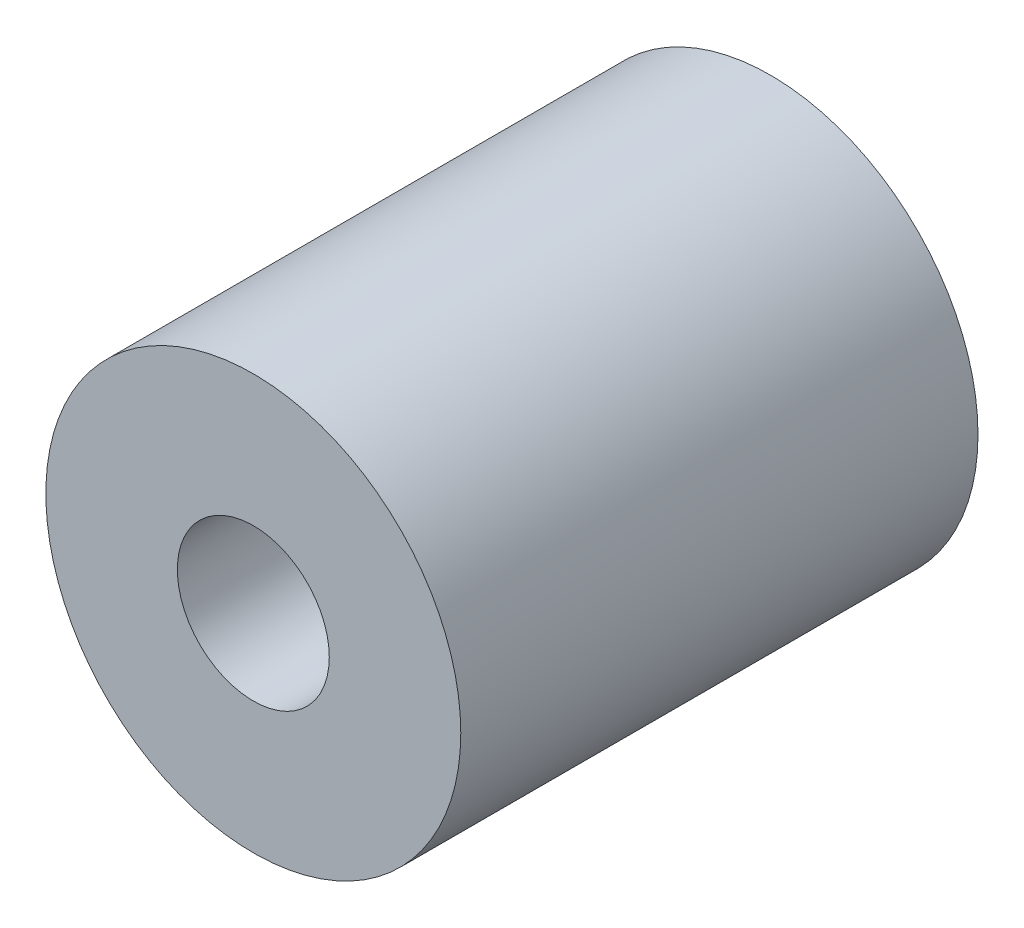
ISO-10303-21;
HEADER;
FILE_DESCRIPTION(('STEP AP214'),'2;1');
FILE_NAME('part.step','',(''),(''),'','','');
FILE_SCHEMA(('AUTOMOTIVE_DESIGN { 1 0 10303 214 1 1 1 1 }'));
ENDSEC;
DATA;
#1=APPLICATION_CONTEXT('core data for automotive mechanical design processes');
#2=APPLICATION_PROTOCOL_DEFINITION('international standard','automotive_design',2000,#1);
#3=PRODUCT_CONTEXT('',#1,'mechanical');
#4=PRODUCT('Part','Part','',(#3));
#5=PRODUCT_RELATED_PRODUCT_CATEGORY('part','',(#4));
#6=PRODUCT_DEFINITION_FORMATION('','',#4);
#7=PRODUCT_DEFINITION_CONTEXT('part definition',#1,'design');
#8=PRODUCT_DEFINITION('design','',#6,#7);
#9=PRODUCT_DEFINITION_SHAPE('','',#8);
#10=(LENGTH_UNIT() NAMED_UNIT(*) SI_UNIT(.MILLI.,.METRE.));
#11=(NAMED_UNIT(*) PLANE_ANGLE_UNIT() SI_UNIT($,.RADIAN.));
#12=(NAMED_UNIT(*) SI_UNIT($,.STERADIAN.) SOLID_ANGLE_UNIT());
#13=UNCERTAINTY_MEASURE_WITH_UNIT(LENGTH_MEASURE(1.E-05),#10,'distance_accuracy_value','');
#14=(GEOMETRIC_REPRESENTATION_CONTEXT(3) GLOBAL_UNCERTAINTY_ASSIGNED_CONTEXT((#13)) GLOBAL_UNIT_ASSIGNED_CONTEXT((#10,
#11,#12)) REPRESENTATION_CONTEXT('',''));
#15=CARTESIAN_POINT('',(0.,0.,0.));
#16=DIRECTION('',(0.,0.,1.));
#17=DIRECTION('',(1.,0.,0.));
#18=AXIS2_PLACEMENT_3D('',#15,#16,#17);
#19=CARTESIAN_POINT('',(0.,0.,177.));
#20=DIRECTION('',(0.,0.,1.));
#21=DIRECTION('',(1.,0.,0.));
#22=AXIS2_PLACEMENT_3D('',#19,#20,#21);
#23=PLANE('',#22);
#24=CARTESIAN_POINT('',(0.,0.,177.));
#25=DIRECTION('',(0.,0.,1.));
#26=DIRECTION('',(1.,0.,0.));
#27=AXIS2_PLACEMENT_3D('',#24,#25,#26);
#28=CIRCLE('',#27,71.);
#29=CARTESIAN_POINT('',(71.,0.,177.));
#30=VERTEX_POINT('',#29);
#31=EDGE_CURVE('E10',#30,#30,#28,.T.);
#32=ORIENTED_EDGE('',*,*,#31,.T.);
#33=EDGE_LOOP('',(#32));
#34=FACE_BOUND('',#33,.T.);
#35=CARTESIAN_POINT('',(0.,0.,177.));
#36=DIRECTION('',(0.,0.,1.));
#37=DIRECTION('',(1.,0.,0.));
#38=AXIS2_PLACEMENT_3D('',#35,#36,#37);
#39=CIRCLE('',#38,26.);
#40=CARTESIAN_POINT('',(26.,0.,177.));
#41=VERTEX_POINT('',#40);
#42=EDGE_CURVE('E50',#41,#41,#39,.T.);
#43=ORIENTED_EDGE('',*,*,#42,.F.);
#44=EDGE_LOOP('',(#43));
#45=FACE_BOUND('',#44,.T.);
#46=ADVANCED_FACE('F39',(#34,#45),#23,.T.);
#47=CARTESIAN_POINT('',(0.,0.,0.));
#48=DIRECTION('',(0.,0.,1.));
#49=DIRECTION('',(1.,0.,0.));
#50=AXIS2_PLACEMENT_3D('',#47,#48,#49);
#51=PLANE('',#50);
#52=CARTESIAN_POINT('',(0.,0.,0.));
#53=DIRECTION('',(0.,0.,1.));
#54=DIRECTION('',(1.,0.,0.));
#55=AXIS2_PLACEMENT_3D('',#52,#53,#54);
#56=CIRCLE('',#55,71.);
#57=CARTESIAN_POINT('',(71.,0.,0.));
#58=VERTEX_POINT('',#57);
#59=EDGE_CURVE('E43',#58,#58,#56,.T.);
#60=ORIENTED_EDGE('',*,*,#59,.F.);
#61=EDGE_LOOP('',(#60));
#62=FACE_BOUND('',#61,.T.);
#63=CARTESIAN_POINT('',(0.,0.,0.));
#64=DIRECTION('',(0.,0.,1.));
#65=DIRECTION('',(1.,0.,0.));
#66=AXIS2_PLACEMENT_3D('',#63,#64,#65);
#67=CIRCLE('',#66,26.);
#68=CARTESIAN_POINT('',(26.,0.,0.));
#69=VERTEX_POINT('',#68);
#70=EDGE_CURVE('E52',#69,#69,#67,.T.);
#71=ORIENTED_EDGE('',*,*,#70,.T.);
#72=EDGE_LOOP('',(#71));
#73=FACE_BOUND('',#72,.T.);
#74=ADVANCED_FACE('F62',(#62,#73),#51,.F.);
#75=CARTESIAN_POINT('',(0.,0.,177.));
#76=DIRECTION('',(0.,0.,-1.));
#77=DIRECTION('',(-1.,0.,0.));
#78=AXIS2_PLACEMENT_3D('',#75,#76,#77);
#79=CYLINDRICAL_SURFACE('',#78,71.);
#80=ORIENTED_EDGE('',*,*,#31,.F.);
#81=EDGE_LOOP('',(#80));
#82=FACE_BOUND('',#81,.T.);
#83=ORIENTED_EDGE('',*,*,#59,.T.);
#84=EDGE_LOOP('',(#83));
#85=FACE_BOUND('',#84,.T.);
#86=ADVANCED_FACE('F41',(#82,#85),#79,.T.);
#87=CARTESIAN_POINT('',(0.,0.,177.));
#88=DIRECTION('',(0.,0.,-1.));
#89=DIRECTION('',(-1.,0.,0.));
#90=AXIS2_PLACEMENT_3D('',#87,#88,#89);
#91=CYLINDRICAL_SURFACE('',#90,26.);
#92=ORIENTED_EDGE('',*,*,#42,.T.);
#93=EDGE_LOOP('',(#92));
#94=FACE_BOUND('',#93,.T.);
#95=ORIENTED_EDGE('',*,*,#70,.F.);
#96=EDGE_LOOP('',(#95));
#97=FACE_BOUND('',#96,.T.);
#98=ADVANCED_FACE('F58',(#94,#97),#91,.F.);
#99=CLOSED_SHELL('',(#46,#74,#86,#98));
#100=MANIFOLD_SOLID_BREP('B2',#99);
#101=ADVANCED_BREP_SHAPE_REPRESENTATION('',(#18,#100),#14);
#102=SHAPE_DEFINITION_REPRESENTATION(#9,#101);
ENDSEC;
END-ISO-10303-21;
